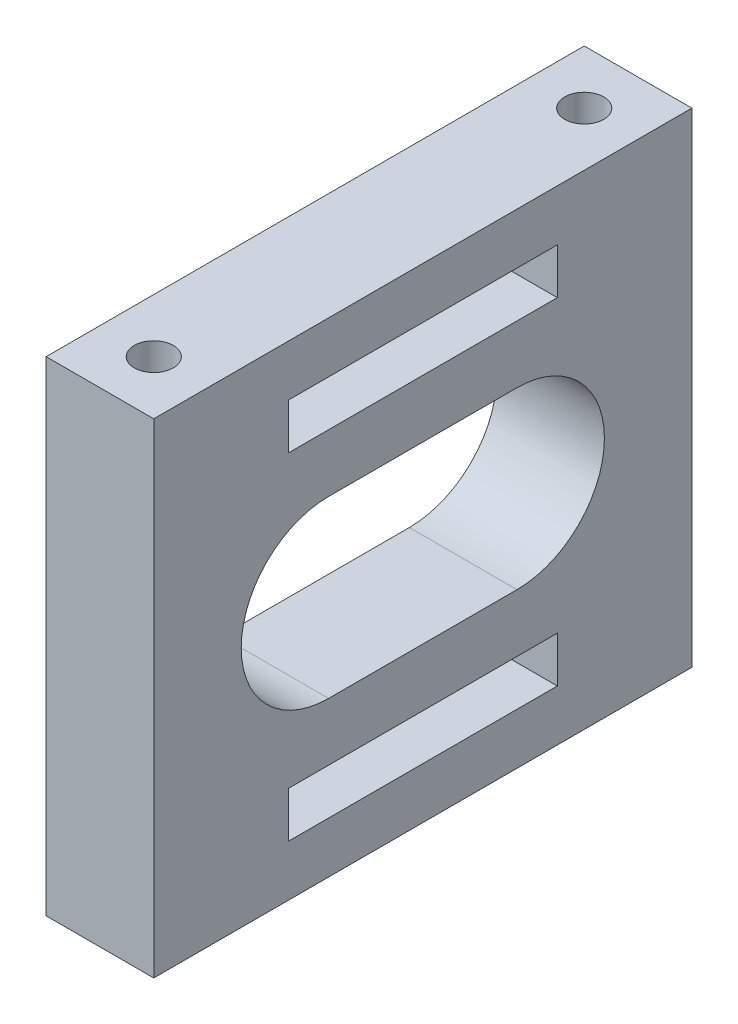
ISO-10303-21;
HEADER;
FILE_DESCRIPTION(('STEP AP214'),'2;1');
FILE_NAME('part.step','',(''),(''),'','','');
FILE_SCHEMA(('AUTOMOTIVE_DESIGN { 1 0 10303 214 1 1 1 1 }'));
ENDSEC;
DATA;
#1=APPLICATION_CONTEXT('core data for automotive mechanical design processes');
#2=APPLICATION_PROTOCOL_DEFINITION('international standard','automotive_design',2000,#1);
#3=PRODUCT_CONTEXT('',#1,'mechanical');
#4=PRODUCT('Part','Part','',(#3));
#5=PRODUCT_RELATED_PRODUCT_CATEGORY('part','',(#4));
#6=PRODUCT_DEFINITION_FORMATION('','',#4);
#7=PRODUCT_DEFINITION_CONTEXT('part definition',#1,'design');
#8=PRODUCT_DEFINITION('design','',#6,#7);
#9=PRODUCT_DEFINITION_SHAPE('','',#8);
#10=(LENGTH_UNIT() NAMED_UNIT(*) SI_UNIT(.MILLI.,.METRE.));
#11=(NAMED_UNIT(*) PLANE_ANGLE_UNIT() SI_UNIT($,.RADIAN.));
#12=(NAMED_UNIT(*) SI_UNIT($,.STERADIAN.) SOLID_ANGLE_UNIT());
#13=UNCERTAINTY_MEASURE_WITH_UNIT(LENGTH_MEASURE(1.E-05),#10,'distance_accuracy_value','');
#14=(GEOMETRIC_REPRESENTATION_CONTEXT(3) GLOBAL_UNCERTAINTY_ASSIGNED_CONTEXT((#13)) GLOBAL_UNIT_ASSIGNED_CONTEXT((#10,
#11,#12)) REPRESENTATION_CONTEXT('',''));
#15=CARTESIAN_POINT('',(0.,0.,0.));
#16=DIRECTION('',(0.,0.,1.));
#17=DIRECTION('',(1.,0.,0.));
#18=AXIS2_PLACEMENT_3D('',#15,#16,#17);
#19=CARTESIAN_POINT('',(8.,0.,0.));
#20=DIRECTION('',(1.,0.,0.));
#21=DIRECTION('',(0.,0.,-1.));
#22=AXIS2_PLACEMENT_3D('',#19,#20,#21);
#23=PLANE('',#22);
#24=DIRECTION('',(0.,-1.,0.));
#25=VECTOR('',#24,1.);
#26=CARTESIAN_POINT('',(8.,0.,0.));
#27=LINE('',#26,#25);
#28=CARTESIAN_POINT('',(8.,0.,0.));
#29=VERTEX_POINT('',#28);
#30=CARTESIAN_POINT('',(8.,-36.,0.));
#31=VERTEX_POINT('',#30);
#32=EDGE_CURVE('E299',#29,#31,#27,.T.);
#33=ORIENTED_EDGE('',*,*,#32,.T.);
#34=DIRECTION('',(0.,0.,-1.));
#35=VECTOR('',#34,1.);
#36=CARTESIAN_POINT('',(8.,-36.,0.));
#37=LINE('',#36,#35);
#38=CARTESIAN_POINT('',(8.,-36.,-40.));
#39=VERTEX_POINT('',#38);
#40=EDGE_CURVE('E302',#31,#39,#37,.T.);
#41=ORIENTED_EDGE('',*,*,#40,.T.);
#42=DIRECTION('',(0.,1.,0.));
#43=VECTOR('',#42,1.);
#44=CARTESIAN_POINT('',(8.,0.,-40.));
#45=LINE('',#44,#43);
#46=CARTESIAN_POINT('',(8.,0.,-40.));
#47=VERTEX_POINT('',#46);
#48=EDGE_CURVE('E305',#39,#47,#45,.T.);
#49=ORIENTED_EDGE('',*,*,#48,.T.);
#50=DIRECTION('',(0.,0.,1.));
#51=VECTOR('',#50,1.);
#52=CARTESIAN_POINT('',(8.,0.,0.));
#53=LINE('',#52,#51);
#54=EDGE_CURVE('E307',#47,#29,#53,.T.);
#55=ORIENTED_EDGE('',*,*,#54,.T.);
#56=EDGE_LOOP('',(#33,#41,#49,#55));
#57=FACE_BOUND('',#56,.T.);
#58=DIRECTION('',(0.,-1.,0.));
#59=VECTOR('',#58,1.);
#60=CARTESIAN_POINT('',(8.,-3.8,-10.));
#61=LINE('',#60,#59);
#62=CARTESIAN_POINT('',(8.,-3.8,-10.));
#63=VERTEX_POINT('',#62);
#64=CARTESIAN_POINT('',(8.,-7.2,-10.));
#65=VERTEX_POINT('',#64);
#66=EDGE_CURVE('E260',#63,#65,#61,.T.);
#67=ORIENTED_EDGE('',*,*,#66,.F.);
#68=DIRECTION('',(0.,0.,1.));
#69=VECTOR('',#68,1.);
#70=CARTESIAN_POINT('',(8.,-3.8,-10.));
#71=LINE('',#70,#69);
#72=CARTESIAN_POINT('',(8.,-3.8,-30.));
#73=VERTEX_POINT('',#72);
#74=EDGE_CURVE('E271',#73,#63,#71,.T.);
#75=ORIENTED_EDGE('',*,*,#74,.F.);
#76=DIRECTION('',(0.,1.,0.));
#77=VECTOR('',#76,1.);
#78=CARTESIAN_POINT('',(8.,-3.8,-30.));
#79=LINE('',#78,#77);
#80=CARTESIAN_POINT('',(8.,-7.2,-30.));
#81=VERTEX_POINT('',#80);
#82=EDGE_CURVE('E285',#81,#73,#79,.T.);
#83=ORIENTED_EDGE('',*,*,#82,.F.);
#84=DIRECTION('',(0.,0.,-1.));
#85=VECTOR('',#84,1.);
#86=CARTESIAN_POINT('',(8.,-7.2,-10.));
#87=LINE('',#86,#85);
#88=EDGE_CURVE('E282',#65,#81,#87,.T.);
#89=ORIENTED_EDGE('',*,*,#88,.F.);
#90=EDGE_LOOP('',(#67,#75,#83,#89));
#91=FACE_BOUND('',#90,.T.);
#92=DIRECTION('',(0.,-1.,0.));
#93=VECTOR('',#92,1.);
#94=CARTESIAN_POINT('',(8.,-28.8,-10.0000000000003));
#95=LINE('',#94,#93);
#96=CARTESIAN_POINT('',(8.,-28.8,-10.0000000000003));
#97=VERTEX_POINT('',#96);
#98=CARTESIAN_POINT('',(8.,-32.2,-10.0000000000003));
#99=VERTEX_POINT('',#98);
#100=EDGE_CURVE('E232',#97,#99,#95,.T.);
#101=ORIENTED_EDGE('',*,*,#100,.F.);
#102=DIRECTION('',(0.,0.,1.));
#103=VECTOR('',#102,1.);
#104=CARTESIAN_POINT('',(8.,-28.8,-10.0000000000003));
#105=LINE('',#104,#103);
#106=CARTESIAN_POINT('',(8.,-28.8,-30.0000000000003));
#107=VERTEX_POINT('',#106);
#108=EDGE_CURVE('E239',#107,#97,#105,.T.);
#109=ORIENTED_EDGE('',*,*,#108,.F.);
#110=DIRECTION('',(0.,1.,0.));
#111=VECTOR('',#110,1.);
#112=CARTESIAN_POINT('',(8.,-28.8,-30.0000000000003));
#113=LINE('',#112,#111);
#114=CARTESIAN_POINT('',(8.,-32.2,-30.0000000000003));
#115=VERTEX_POINT('',#114);
#116=EDGE_CURVE('E253',#115,#107,#113,.T.);
#117=ORIENTED_EDGE('',*,*,#116,.F.);
#118=DIRECTION('',(0.,0.,-1.));
#119=VECTOR('',#118,1.);
#120=CARTESIAN_POINT('',(8.,-32.2,-10.0000000000003));
#121=LINE('',#120,#119);
#122=EDGE_CURVE('E250',#99,#115,#121,.T.);
#123=ORIENTED_EDGE('',*,*,#122,.F.);
#124=EDGE_LOOP('',(#101,#109,#117,#123));
#125=FACE_BOUND('',#124,.T.);
#126=CARTESIAN_POINT('',(8.,-18.,-13.));
#127=DIRECTION('',(1.,0.,0.));
#128=DIRECTION('',(0.,0.,-1.));
#129=AXIS2_PLACEMENT_3D('',#126,#127,#128);
#130=CIRCLE('',#129,6.5);
#131=CARTESIAN_POINT('',(8.,-11.5,-13.));
#132=VERTEX_POINT('',#131);
#133=CARTESIAN_POINT('',(8.,-24.5,-13.));
#134=VERTEX_POINT('',#133);
#135=EDGE_CURVE('E89',#132,#134,#130,.T.);
#136=ORIENTED_EDGE('',*,*,#135,.F.);
#137=DIRECTION('',(0.,0.,-1.));
#138=VECTOR('',#137,1.);
#139=CARTESIAN_POINT('',(8.,-11.5,-13.));
#140=LINE('',#139,#138);
#141=CARTESIAN_POINT('',(8.,-11.5,-27.));
#142=VERTEX_POINT('',#141);
#143=EDGE_CURVE('E197',#132,#142,#140,.T.);
#144=ORIENTED_EDGE('',*,*,#143,.T.);
#145=CARTESIAN_POINT('',(8.,-18.,-27.));
#146=DIRECTION('',(1.,0.,0.));
#147=DIRECTION('',(0.,0.,-1.));
#148=AXIS2_PLACEMENT_3D('',#145,#146,#147);
#149=CIRCLE('',#148,6.5);
#150=CARTESIAN_POINT('',(8.,-24.5,-27.));
#151=VERTEX_POINT('',#150);
#152=EDGE_CURVE('E221',#151,#142,#149,.T.);
#153=ORIENTED_EDGE('',*,*,#152,.F.);
#154=DIRECTION('',(0.,0.,-1.));
#155=VECTOR('',#154,1.);
#156=CARTESIAN_POINT('',(8.,-24.5,-13.));
#157=LINE('',#156,#155);
#158=EDGE_CURVE('E203',#134,#151,#157,.T.);
#159=ORIENTED_EDGE('',*,*,#158,.F.);
#160=EDGE_LOOP('',(#136,#144,#153,#159));
#161=FACE_BOUND('',#160,.T.);
#162=ADVANCED_FACE('F74',(#57,#91,#125,#161),#23,.T.);
#163=CARTESIAN_POINT('',(0.,0.,0.));
#164=DIRECTION('',(1.,0.,0.));
#165=DIRECTION('',(0.,0.,-1.));
#166=AXIS2_PLACEMENT_3D('',#163,#164,#165);
#167=PLANE('',#166);
#168=DIRECTION('',(0.,-1.,0.));
#169=VECTOR('',#168,1.);
#170=CARTESIAN_POINT('',(0.,0.,0.));
#171=LINE('',#170,#169);
#172=CARTESIAN_POINT('',(0.,0.,0.));
#173=VERTEX_POINT('',#172);
#174=CARTESIAN_POINT('',(0.,-36.,0.));
#175=VERTEX_POINT('',#174);
#176=EDGE_CURVE('E292',#173,#175,#171,.T.);
#177=ORIENTED_EDGE('',*,*,#176,.F.);
#178=DIRECTION('',(0.,0.,1.));
#179=VECTOR('',#178,1.);
#180=CARTESIAN_POINT('',(0.,0.,0.));
#181=LINE('',#180,#179);
#182=CARTESIAN_POINT('',(0.,0.,-40.));
#183=VERTEX_POINT('',#182);
#184=EDGE_CURVE('E303',#183,#173,#181,.T.);
#185=ORIENTED_EDGE('',*,*,#184,.F.);
#186=DIRECTION('',(0.,1.,0.));
#187=VECTOR('',#186,1.);
#188=CARTESIAN_POINT('',(0.,0.,-40.));
#189=LINE('',#188,#187);
#190=CARTESIAN_POINT('',(0.,-36.,-40.));
#191=VERTEX_POINT('',#190);
#192=EDGE_CURVE('E314',#191,#183,#189,.T.);
#193=ORIENTED_EDGE('',*,*,#192,.F.);
#194=DIRECTION('',(0.,0.,-1.));
#195=VECTOR('',#194,1.);
#196=CARTESIAN_POINT('',(0.,-36.,0.));
#197=LINE('',#196,#195);
#198=EDGE_CURVE('E312',#175,#191,#197,.T.);
#199=ORIENTED_EDGE('',*,*,#198,.F.);
#200=EDGE_LOOP('',(#177,#185,#193,#199));
#201=FACE_BOUND('',#200,.T.);
#202=DIRECTION('',(0.,0.,1.));
#203=VECTOR('',#202,1.);
#204=CARTESIAN_POINT('',(0.,-3.8,-10.));
#205=LINE('',#204,#203);
#206=CARTESIAN_POINT('',(0.,-3.8,-30.));
#207=VERTEX_POINT('',#206);
#208=CARTESIAN_POINT('',(0.,-3.8,-10.));
#209=VERTEX_POINT('',#208);
#210=EDGE_CURVE('E277',#207,#209,#205,.T.);
#211=ORIENTED_EDGE('',*,*,#210,.T.);
#212=DIRECTION('',(0.,-1.,0.));
#213=VECTOR('',#212,1.);
#214=CARTESIAN_POINT('',(0.,-3.8,-10.));
#215=LINE('',#214,#213);
#216=CARTESIAN_POINT('',(0.,-7.2,-10.));
#217=VERTEX_POINT('',#216);
#218=EDGE_CURVE('E267',#209,#217,#215,.T.);
#219=ORIENTED_EDGE('',*,*,#218,.T.);
#220=DIRECTION('',(0.,0.,-1.));
#221=VECTOR('',#220,1.);
#222=CARTESIAN_POINT('',(0.,-7.2,-10.));
#223=LINE('',#222,#221);
#224=CARTESIAN_POINT('',(0.,-7.2,-30.));
#225=VERTEX_POINT('',#224);
#226=EDGE_CURVE('E270',#217,#225,#223,.T.);
#227=ORIENTED_EDGE('',*,*,#226,.T.);
#228=DIRECTION('',(0.,1.,0.));
#229=VECTOR('',#228,1.);
#230=CARTESIAN_POINT('',(0.,-3.8,-30.));
#231=LINE('',#230,#229);
#232=EDGE_CURVE('E274',#225,#207,#231,.T.);
#233=ORIENTED_EDGE('',*,*,#232,.T.);
#234=EDGE_LOOP('',(#211,#219,#227,#233));
#235=FACE_BOUND('',#234,.T.);
#236=DIRECTION('',(0.,0.,1.));
#237=VECTOR('',#236,1.);
#238=CARTESIAN_POINT('',(0.,-28.8,-10.0000000000003));
#239=LINE('',#238,#237);
#240=CARTESIAN_POINT('',(0.,-28.8,-30.0000000000003));
#241=VERTEX_POINT('',#240);
#242=CARTESIAN_POINT('',(0.,-28.8,-10.0000000000003));
#243=VERTEX_POINT('',#242);
#244=EDGE_CURVE('E245',#241,#243,#239,.T.);
#245=ORIENTED_EDGE('',*,*,#244,.T.);
#246=DIRECTION('',(0.,-1.,0.));
#247=VECTOR('',#246,1.);
#248=CARTESIAN_POINT('',(0.,-28.8,-10.0000000000003));
#249=LINE('',#248,#247);
#250=CARTESIAN_POINT('',(0.,-32.2,-10.0000000000003));
#251=VERTEX_POINT('',#250);
#252=EDGE_CURVE('E235',#243,#251,#249,.T.);
#253=ORIENTED_EDGE('',*,*,#252,.T.);
#254=DIRECTION('',(0.,0.,-1.));
#255=VECTOR('',#254,1.);
#256=CARTESIAN_POINT('',(0.,-32.2,-10.0000000000003));
#257=LINE('',#256,#255);
#258=CARTESIAN_POINT('',(0.,-32.2,-30.0000000000003));
#259=VERTEX_POINT('',#258);
#260=EDGE_CURVE('E238',#251,#259,#257,.T.);
#261=ORIENTED_EDGE('',*,*,#260,.T.);
#262=DIRECTION('',(0.,1.,0.));
#263=VECTOR('',#262,1.);
#264=CARTESIAN_POINT('',(0.,-28.8,-30.0000000000003));
#265=LINE('',#264,#263);
#266=EDGE_CURVE('E242',#259,#241,#265,.T.);
#267=ORIENTED_EDGE('',*,*,#266,.T.);
#268=EDGE_LOOP('',(#245,#253,#261,#267));
#269=FACE_BOUND('',#268,.T.);
#270=DIRECTION('',(0.,0.,-1.));
#271=VECTOR('',#270,1.);
#272=CARTESIAN_POINT('',(0.,-11.5,-13.));
#273=LINE('',#272,#271);
#274=CARTESIAN_POINT('',(0.,-11.5,-13.));
#275=VERTEX_POINT('',#274);
#276=CARTESIAN_POINT('',(0.,-11.5,-27.));
#277=VERTEX_POINT('',#276);
#278=EDGE_CURVE('E213',#275,#277,#273,.T.);
#279=ORIENTED_EDGE('',*,*,#278,.F.);
#280=CARTESIAN_POINT('',(0.,-18.,-13.));
#281=DIRECTION('',(1.,0.,0.));
#282=DIRECTION('',(0.,0.,-1.));
#283=AXIS2_PLACEMENT_3D('',#280,#281,#282);
#284=CIRCLE('',#283,6.5);
#285=CARTESIAN_POINT('',(0.,-24.5,-13.));
#286=VERTEX_POINT('',#285);
#287=EDGE_CURVE('E189',#275,#286,#284,.T.);
#288=ORIENTED_EDGE('',*,*,#287,.T.);
#289=DIRECTION('',(0.,0.,-1.));
#290=VECTOR('',#289,1.);
#291=CARTESIAN_POINT('',(0.,-24.5,-13.));
#292=LINE('',#291,#290);
#293=CARTESIAN_POINT('',(0.,-24.5,-27.));
#294=VERTEX_POINT('',#293);
#295=EDGE_CURVE('E215',#286,#294,#292,.T.);
#296=ORIENTED_EDGE('',*,*,#295,.T.);
#297=CARTESIAN_POINT('',(0.,-18.,-27.));
#298=DIRECTION('',(1.,0.,0.));
#299=DIRECTION('',(0.,0.,-1.));
#300=AXIS2_PLACEMENT_3D('',#297,#298,#299);
#301=CIRCLE('',#300,6.5);
#302=EDGE_CURVE('E97',#294,#277,#301,.T.);
#303=ORIENTED_EDGE('',*,*,#302,.T.);
#304=EDGE_LOOP('',(#279,#288,#296,#303));
#305=FACE_BOUND('',#304,.T.);
#306=ADVANCED_FACE('F332',(#201,#235,#269,#305),#167,.F.);
#307=CARTESIAN_POINT('',(8.,0.,0.));
#308=DIRECTION('',(0.,0.,-1.));
#309=DIRECTION('',(0.,1.,0.));
#310=AXIS2_PLACEMENT_3D('',#307,#308,#309);
#311=PLANE('',#310);
#312=ORIENTED_EDGE('',*,*,#176,.T.);
#313=DIRECTION('',(-1.,0.,0.));
#314=VECTOR('',#313,1.);
#315=CARTESIAN_POINT('',(8.,-36.,0.));
#316=LINE('',#315,#314);
#317=EDGE_CURVE('E14',#31,#175,#316,.T.);
#318=ORIENTED_EDGE('',*,*,#317,.F.);
#319=ORIENTED_EDGE('',*,*,#32,.F.);
#320=DIRECTION('',(-1.,0.,0.));
#321=VECTOR('',#320,1.);
#322=CARTESIAN_POINT('',(8.,0.,0.));
#323=LINE('',#322,#321);
#324=EDGE_CURVE('E309',#29,#173,#323,.T.);
#325=ORIENTED_EDGE('',*,*,#324,.T.);
#326=EDGE_LOOP('',(#312,#318,#319,#325));
#327=FACE_BOUND('',#326,.T.);
#328=ADVANCED_FACE('F76',(#327),#311,.F.);
#329=CARTESIAN_POINT('',(8.,-36.,0.));
#330=DIRECTION('',(0.,1.,0.));
#331=DIRECTION('',(0.,0.,1.));
#332=AXIS2_PLACEMENT_3D('',#329,#330,#331);
#333=PLANE('',#332);
#334=CARTESIAN_POINT('',(3.99999999999989,-36.,-36.));
#335=DIRECTION('',(0.,1.,0.));
#336=DIRECTION('',(0.,0.,1.));
#337=AXIS2_PLACEMENT_3D('',#334,#335,#336);
#338=CIRCLE('',#337,1.45);
#339=CARTESIAN_POINT('',(3.99999999999989,-36.,-34.55));
#340=VERTEX_POINT('',#339);
#341=EDGE_CURVE('E223',#340,#340,#338,.T.);
#342=ORIENTED_EDGE('',*,*,#341,.T.);
#343=EDGE_LOOP('',(#342));
#344=FACE_BOUND('',#343,.T.);
#345=CARTESIAN_POINT('',(4.,-36.,-4.));
#346=DIRECTION('',(0.,1.,0.));
#347=DIRECTION('',(0.,0.,1.));
#348=AXIS2_PLACEMENT_3D('',#345,#346,#347);
#349=CIRCLE('',#348,1.45);
#350=CARTESIAN_POINT('',(4.,-36.,-2.55));
#351=VERTEX_POINT('',#350);
#352=EDGE_CURVE('E229',#351,#351,#349,.T.);
#353=ORIENTED_EDGE('',*,*,#352,.T.);
#354=EDGE_LOOP('',(#353));
#355=FACE_BOUND('',#354,.T.);
#356=ORIENTED_EDGE('',*,*,#198,.T.);
#357=DIRECTION('',(-1.,0.,0.));
#358=VECTOR('',#357,1.);
#359=CARTESIAN_POINT('',(8.,-36.,-40.));
#360=LINE('',#359,#358);
#361=EDGE_CURVE('E82',#39,#191,#360,.T.);
#362=ORIENTED_EDGE('',*,*,#361,.F.);
#363=ORIENTED_EDGE('',*,*,#40,.F.);
#364=ORIENTED_EDGE('',*,*,#317,.T.);
#365=EDGE_LOOP('',(#356,#362,#363,#364));
#366=FACE_BOUND('',#365,.T.);
#367=ADVANCED_FACE('F343',(#344,#355,#366),#333,.F.);
#368=CARTESIAN_POINT('',(8.,0.,-40.));
#369=DIRECTION('',(0.,0.,1.));
#370=DIRECTION('',(0.,-1.,0.));
#371=AXIS2_PLACEMENT_3D('',#368,#369,#370);
#372=PLANE('',#371);
#373=ORIENTED_EDGE('',*,*,#192,.T.);
#374=DIRECTION('',(-1.,0.,0.));
#375=VECTOR('',#374,1.);
#376=CARTESIAN_POINT('',(8.,0.,-40.));
#377=LINE('',#376,#375);
#378=EDGE_CURVE('E319',#47,#183,#377,.T.);
#379=ORIENTED_EDGE('',*,*,#378,.F.);
#380=ORIENTED_EDGE('',*,*,#48,.F.);
#381=ORIENTED_EDGE('',*,*,#361,.T.);
#382=EDGE_LOOP('',(#373,#379,#380,#381));
#383=FACE_BOUND('',#382,.T.);
#384=ADVANCED_FACE('F326',(#383),#372,.F.);
#385=CARTESIAN_POINT('',(8.,0.,0.));
#386=DIRECTION('',(0.,-1.,0.));
#387=DIRECTION('',(0.,0.,-1.));
#388=AXIS2_PLACEMENT_3D('',#385,#386,#387);
#389=PLANE('',#388);
#390=CARTESIAN_POINT('',(3.99999999999989,0.,-36.));
#391=DIRECTION('',(0.,1.,0.));
#392=DIRECTION('',(0.,0.,1.));
#393=AXIS2_PLACEMENT_3D('',#390,#391,#392);
#394=CIRCLE('',#393,1.45);
#395=CARTESIAN_POINT('',(3.99999999999989,0.,-34.55));
#396=VERTEX_POINT('',#395);
#397=EDGE_CURVE('E193',#396,#396,#394,.T.);
#398=ORIENTED_EDGE('',*,*,#397,.F.);
#399=EDGE_LOOP('',(#398));
#400=FACE_BOUND('',#399,.T.);
#401=CARTESIAN_POINT('',(4.,0.,-4.));
#402=DIRECTION('',(0.,1.,0.));
#403=DIRECTION('',(0.,0.,1.));
#404=AXIS2_PLACEMENT_3D('',#401,#402,#403);
#405=CIRCLE('',#404,1.45);
#406=CARTESIAN_POINT('',(4.,0.,-2.55));
#407=VERTEX_POINT('',#406);
#408=EDGE_CURVE('E226',#407,#407,#405,.T.);
#409=ORIENTED_EDGE('',*,*,#408,.F.);
#410=EDGE_LOOP('',(#409));
#411=FACE_BOUND('',#410,.T.);
#412=ORIENTED_EDGE('',*,*,#184,.T.);
#413=ORIENTED_EDGE('',*,*,#324,.F.);
#414=ORIENTED_EDGE('',*,*,#54,.F.);
#415=ORIENTED_EDGE('',*,*,#378,.T.);
#416=EDGE_LOOP('',(#412,#413,#414,#415));
#417=FACE_BOUND('',#416,.T.);
#418=ADVANCED_FACE('F336',(#400,#411,#417),#389,.F.);
#419=CARTESIAN_POINT('',(0.,-3.8,-10.));
#420=DIRECTION('',(0.,0.,1.));
#421=DIRECTION('',(1.,0.,0.));
#422=AXIS2_PLACEMENT_3D('',#419,#420,#421);
#423=PLANE('',#422);
#424=ORIENTED_EDGE('',*,*,#66,.T.);
#425=DIRECTION('',(1.,0.,0.));
#426=VECTOR('',#425,1.);
#427=CARTESIAN_POINT('',(0.,-7.2,-10.));
#428=LINE('',#427,#426);
#429=EDGE_CURVE('E280',#217,#65,#428,.T.);
#430=ORIENTED_EDGE('',*,*,#429,.F.);
#431=ORIENTED_EDGE('',*,*,#218,.F.);
#432=DIRECTION('',(1.,0.,0.));
#433=VECTOR('',#432,1.);
#434=CARTESIAN_POINT('',(0.,-3.8,-10.));
#435=LINE('',#434,#433);
#436=EDGE_CURVE('E290',#209,#63,#435,.T.);
#437=ORIENTED_EDGE('',*,*,#436,.T.);
#438=EDGE_LOOP('',(#424,#430,#431,#437));
#439=FACE_BOUND('',#438,.T.);
#440=ADVANCED_FACE('F359',(#439),#423,.F.);
#441=CARTESIAN_POINT('',(0.,-3.8,-10.));
#442=DIRECTION('',(0.,1.,0.));
#443=DIRECTION('',(0.,0.,1.));
#444=AXIS2_PLACEMENT_3D('',#441,#442,#443);
#445=PLANE('',#444);
#446=ORIENTED_EDGE('',*,*,#74,.T.);
#447=ORIENTED_EDGE('',*,*,#436,.F.);
#448=ORIENTED_EDGE('',*,*,#210,.F.);
#449=DIRECTION('',(1.,0.,0.));
#450=VECTOR('',#449,1.);
#451=CARTESIAN_POINT('',(0.,-3.8,-30.));
#452=LINE('',#451,#450);
#453=EDGE_CURVE('E293',#207,#73,#452,.T.);
#454=ORIENTED_EDGE('',*,*,#453,.T.);
#455=EDGE_LOOP('',(#446,#447,#448,#454));
#456=FACE_BOUND('',#455,.T.);
#457=ADVANCED_FACE('F367',(#456),#445,.F.);
#458=CARTESIAN_POINT('',(0.,-3.8,-30.));
#459=DIRECTION('',(0.,0.,-1.));
#460=DIRECTION('',(-1.,0.,0.));
#461=AXIS2_PLACEMENT_3D('',#458,#459,#460);
#462=PLANE('',#461);
#463=ORIENTED_EDGE('',*,*,#82,.T.);
#464=ORIENTED_EDGE('',*,*,#453,.F.);
#465=ORIENTED_EDGE('',*,*,#232,.F.);
#466=DIRECTION('',(1.,0.,0.));
#467=VECTOR('',#466,1.);
#468=CARTESIAN_POINT('',(0.,-7.2,-30.));
#469=LINE('',#468,#467);
#470=EDGE_CURVE('E295',#225,#81,#469,.T.);
#471=ORIENTED_EDGE('',*,*,#470,.T.);
#472=EDGE_LOOP('',(#463,#464,#465,#471));
#473=FACE_BOUND('',#472,.T.);
#474=ADVANCED_FACE('F405',(#473),#462,.F.);
#475=CARTESIAN_POINT('',(0.,-7.2,-10.));
#476=DIRECTION('',(0.,-1.,0.));
#477=DIRECTION('',(0.,0.,-1.));
#478=AXIS2_PLACEMENT_3D('',#475,#476,#477);
#479=PLANE('',#478);
#480=ORIENTED_EDGE('',*,*,#88,.T.);
#481=ORIENTED_EDGE('',*,*,#470,.F.);
#482=ORIENTED_EDGE('',*,*,#226,.F.);
#483=ORIENTED_EDGE('',*,*,#429,.T.);
#484=EDGE_LOOP('',(#480,#481,#482,#483));
#485=FACE_BOUND('',#484,.T.);
#486=ADVANCED_FACE('F401',(#485),#479,.F.);
#487=CARTESIAN_POINT('',(0.,-28.8,-10.0000000000003));
#488=DIRECTION('',(0.,0.,1.));
#489=DIRECTION('',(1.,0.,0.));
#490=AXIS2_PLACEMENT_3D('',#487,#488,#489);
#491=PLANE('',#490);
#492=ORIENTED_EDGE('',*,*,#100,.T.);
#493=DIRECTION('',(1.,0.,0.));
#494=VECTOR('',#493,1.);
#495=CARTESIAN_POINT('',(0.,-32.2,-10.0000000000003));
#496=LINE('',#495,#494);
#497=EDGE_CURVE('E248',#251,#99,#496,.T.);
#498=ORIENTED_EDGE('',*,*,#497,.F.);
#499=ORIENTED_EDGE('',*,*,#252,.F.);
#500=DIRECTION('',(1.,0.,0.));
#501=VECTOR('',#500,1.);
#502=CARTESIAN_POINT('',(0.,-28.8,-10.0000000000003));
#503=LINE('',#502,#501);
#504=EDGE_CURVE('E258',#243,#97,#503,.T.);
#505=ORIENTED_EDGE('',*,*,#504,.T.);
#506=EDGE_LOOP('',(#492,#498,#499,#505));
#507=FACE_BOUND('',#506,.T.);
#508=ADVANCED_FACE('F394',(#507),#491,.F.);
#509=CARTESIAN_POINT('',(0.,-28.8,-10.0000000000003));
#510=DIRECTION('',(0.,1.,0.));
#511=DIRECTION('',(0.,0.,1.));
#512=AXIS2_PLACEMENT_3D('',#509,#510,#511);
#513=PLANE('',#512);
#514=ORIENTED_EDGE('',*,*,#108,.T.);
#515=ORIENTED_EDGE('',*,*,#504,.F.);
#516=ORIENTED_EDGE('',*,*,#244,.F.);
#517=DIRECTION('',(1.,0.,0.));
#518=VECTOR('',#517,1.);
#519=CARTESIAN_POINT('',(0.,-28.8,-30.0000000000003));
#520=LINE('',#519,#518);
#521=EDGE_CURVE('E261',#241,#107,#520,.T.);
#522=ORIENTED_EDGE('',*,*,#521,.T.);
#523=EDGE_LOOP('',(#514,#515,#516,#522));
#524=FACE_BOUND('',#523,.T.);
#525=ADVANCED_FACE('F391',(#524),#513,.F.);
#526=CARTESIAN_POINT('',(0.,-28.8,-30.0000000000003));
#527=DIRECTION('',(0.,0.,-1.));
#528=DIRECTION('',(-1.,0.,0.));
#529=AXIS2_PLACEMENT_3D('',#526,#527,#528);
#530=PLANE('',#529);
#531=ORIENTED_EDGE('',*,*,#116,.T.);
#532=ORIENTED_EDGE('',*,*,#521,.F.);
#533=ORIENTED_EDGE('',*,*,#266,.F.);
#534=DIRECTION('',(1.,0.,0.));
#535=VECTOR('',#534,1.);
#536=CARTESIAN_POINT('',(0.,-32.2,-30.0000000000003));
#537=LINE('',#536,#535);
#538=EDGE_CURVE('E263',#259,#115,#537,.T.);
#539=ORIENTED_EDGE('',*,*,#538,.T.);
#540=EDGE_LOOP('',(#531,#532,#533,#539));
#541=FACE_BOUND('',#540,.T.);
#542=ADVANCED_FACE('F385',(#541),#530,.F.);
#543=CARTESIAN_POINT('',(0.,-32.2,-10.0000000000003));
#544=DIRECTION('',(0.,-1.,0.));
#545=DIRECTION('',(0.,0.,-1.));
#546=AXIS2_PLACEMENT_3D('',#543,#544,#545);
#547=PLANE('',#546);
#548=ORIENTED_EDGE('',*,*,#122,.T.);
#549=ORIENTED_EDGE('',*,*,#538,.F.);
#550=ORIENTED_EDGE('',*,*,#260,.F.);
#551=ORIENTED_EDGE('',*,*,#497,.T.);
#552=EDGE_LOOP('',(#548,#549,#550,#551));
#553=FACE_BOUND('',#552,.T.);
#554=ADVANCED_FACE('F376',(#553),#547,.F.);
#555=CARTESIAN_POINT('',(4.,-36.,-4.));
#556=DIRECTION('',(0.,1.,0.));
#557=DIRECTION('',(0.,0.,1.));
#558=AXIS2_PLACEMENT_3D('',#555,#556,#557);
#559=CYLINDRICAL_SURFACE('',#558,1.45);
#560=ORIENTED_EDGE('',*,*,#352,.F.);
#561=EDGE_LOOP('',(#560));
#562=FACE_BOUND('',#561,.T.);
#563=ORIENTED_EDGE('',*,*,#408,.T.);
#564=EDGE_LOOP('',(#563));
#565=FACE_BOUND('',#564,.T.);
#566=ADVANCED_FACE('F373',(#562,#565),#559,.F.);
#567=CARTESIAN_POINT('',(3.99999999999989,-36.,-36.));
#568=DIRECTION('',(0.,1.,0.));
#569=DIRECTION('',(0.,0.,1.));
#570=AXIS2_PLACEMENT_3D('',#567,#568,#569);
#571=CYLINDRICAL_SURFACE('',#570,1.45);
#572=ORIENTED_EDGE('',*,*,#341,.F.);
#573=EDGE_LOOP('',(#572));
#574=FACE_BOUND('',#573,.T.);
#575=ORIENTED_EDGE('',*,*,#397,.T.);
#576=EDGE_LOOP('',(#575));
#577=FACE_BOUND('',#576,.T.);
#578=ADVANCED_FACE('F375',(#574,#577),#571,.F.);
#579=CARTESIAN_POINT('',(0.,-18.,-13.));
#580=DIRECTION('',(1.,0.,0.));
#581=DIRECTION('',(0.,0.,-1.));
#582=AXIS2_PLACEMENT_3D('',#579,#580,#581);
#583=CYLINDRICAL_SURFACE('',#582,6.5);
#584=ORIENTED_EDGE('',*,*,#135,.T.);
#585=DIRECTION('',(1.,0.,0.));
#586=VECTOR('',#585,1.);
#587=CARTESIAN_POINT('',(0.,-24.5,-13.));
#588=LINE('',#587,#586);
#589=EDGE_CURVE('E194',#134,#286,#588,.F.);
#590=ORIENTED_EDGE('',*,*,#589,.T.);
#591=ORIENTED_EDGE('',*,*,#287,.F.);
#592=DIRECTION('',(1.,0.,0.));
#593=VECTOR('',#592,1.);
#594=CARTESIAN_POINT('',(0.,-11.5,-13.));
#595=LINE('',#594,#593);
#596=EDGE_CURVE('E185',#132,#275,#595,.F.);
#597=ORIENTED_EDGE('',*,*,#596,.F.);
#598=EDGE_LOOP('',(#584,#590,#591,#597));
#599=FACE_BOUND('',#598,.T.);
#600=ADVANCED_FACE('F187',(#599),#583,.F.);
#601=CARTESIAN_POINT('',(0.,-18.,-27.));
#602=DIRECTION('',(1.,0.,0.));
#603=DIRECTION('',(0.,0.,-1.));
#604=AXIS2_PLACEMENT_3D('',#601,#602,#603);
#605=CYLINDRICAL_SURFACE('',#604,6.5);
#606=ORIENTED_EDGE('',*,*,#302,.F.);
#607=DIRECTION('',(1.,0.,0.));
#608=VECTOR('',#607,1.);
#609=CARTESIAN_POINT('',(0.,-24.5,-27.));
#610=LINE('',#609,#608);
#611=EDGE_CURVE('E209',#294,#151,#610,.T.);
#612=ORIENTED_EDGE('',*,*,#611,.T.);
#613=ORIENTED_EDGE('',*,*,#152,.T.);
#614=DIRECTION('',(1.,0.,0.));
#615=VECTOR('',#614,1.);
#616=CARTESIAN_POINT('',(0.,-11.5,-27.));
#617=LINE('',#616,#615);
#618=EDGE_CURVE('E199',#277,#142,#617,.T.);
#619=ORIENTED_EDGE('',*,*,#618,.F.);
#620=EDGE_LOOP('',(#606,#612,#613,#619));
#621=FACE_BOUND('',#620,.T.);
#622=ADVANCED_FACE('F428',(#621),#605,.F.);
#623=CARTESIAN_POINT('',(0.,-11.5,-13.));
#624=DIRECTION('',(0.,-1.,0.));
#625=DIRECTION('',(0.,0.,-1.));
#626=AXIS2_PLACEMENT_3D('',#623,#624,#625);
#627=PLANE('',#626);
#628=ORIENTED_EDGE('',*,*,#143,.F.);
#629=ORIENTED_EDGE('',*,*,#596,.T.);
#630=ORIENTED_EDGE('',*,*,#278,.T.);
#631=ORIENTED_EDGE('',*,*,#618,.T.);
#632=EDGE_LOOP('',(#628,#629,#630,#631));
#633=FACE_BOUND('',#632,.T.);
#634=ADVANCED_FACE('F198',(#633),#627,.T.);
#635=CARTESIAN_POINT('',(0.,-24.5,-13.));
#636=DIRECTION('',(0.,-1.,0.));
#637=DIRECTION('',(0.,0.,-1.));
#638=AXIS2_PLACEMENT_3D('',#635,#636,#637);
#639=PLANE('',#638);
#640=ORIENTED_EDGE('',*,*,#158,.T.);
#641=ORIENTED_EDGE('',*,*,#611,.F.);
#642=ORIENTED_EDGE('',*,*,#295,.F.);
#643=ORIENTED_EDGE('',*,*,#589,.F.);
#644=EDGE_LOOP('',(#640,#641,#642,#643));
#645=FACE_BOUND('',#644,.T.);
#646=ADVANCED_FACE('F427',(#645),#639,.F.);
#647=CLOSED_SHELL('',(#162,#306,#328,#367,#384,#418,#440,#457,#474,#486,#508,#525,#542,#554,
#566,#578,#600,#622,#634,#646));
#648=MANIFOLD_SOLID_BREP('B2',#647);
#649=ADVANCED_BREP_SHAPE_REPRESENTATION('',(#18,#648),#14);
#650=SHAPE_DEFINITION_REPRESENTATION(#9,#649);
ENDSEC;
END-ISO-10303-21;
